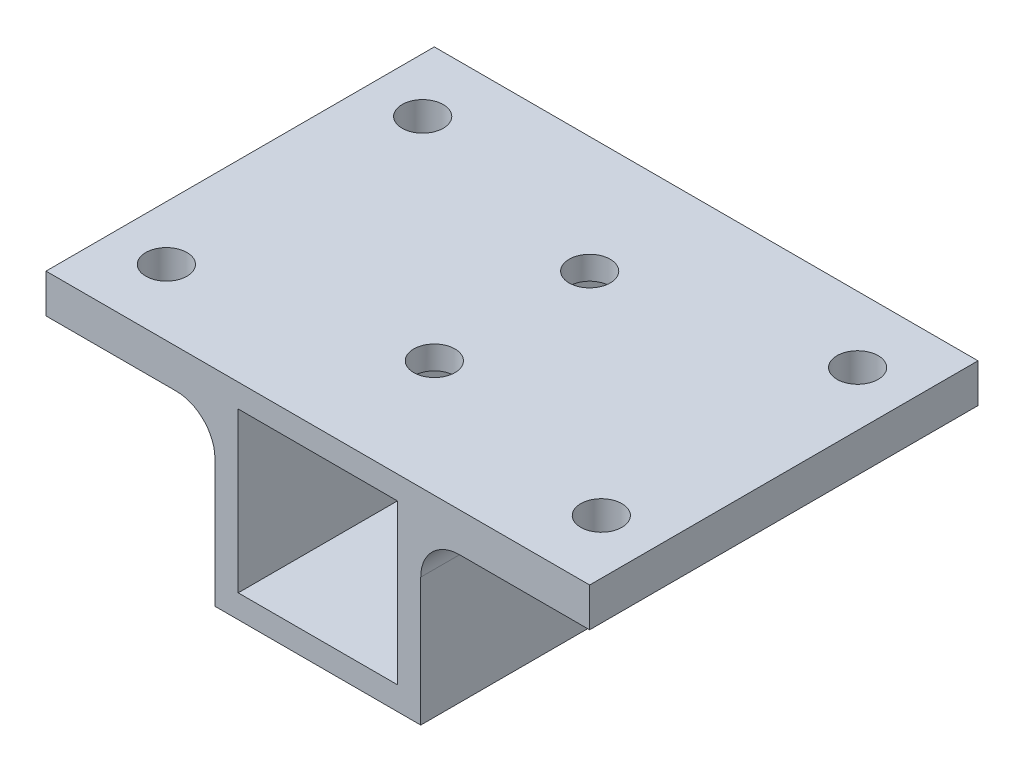
ISO-10303-21;
HEADER;
FILE_DESCRIPTION(('STEP AP214'),'2;1');
FILE_NAME('part.step','',(''),(''),'','','');
FILE_SCHEMA(('AUTOMOTIVE_DESIGN { 1 0 10303 214 1 1 1 1 }'));
ENDSEC;
DATA;
#1=APPLICATION_CONTEXT('core data for automotive mechanical design processes');
#2=APPLICATION_PROTOCOL_DEFINITION('international standard','automotive_design',2000,#1);
#3=PRODUCT_CONTEXT('',#1,'mechanical');
#4=PRODUCT('Part','Part','',(#3));
#5=PRODUCT_RELATED_PRODUCT_CATEGORY('part','',(#4));
#6=PRODUCT_DEFINITION_FORMATION('','',#4);
#7=PRODUCT_DEFINITION_CONTEXT('part definition',#1,'design');
#8=PRODUCT_DEFINITION('design','',#6,#7);
#9=PRODUCT_DEFINITION_SHAPE('','',#8);
#10=(LENGTH_UNIT() NAMED_UNIT(*) SI_UNIT(.MILLI.,.METRE.));
#11=(NAMED_UNIT(*) PLANE_ANGLE_UNIT() SI_UNIT($,.RADIAN.));
#12=(NAMED_UNIT(*) SI_UNIT($,.STERADIAN.) SOLID_ANGLE_UNIT());
#13=UNCERTAINTY_MEASURE_WITH_UNIT(LENGTH_MEASURE(1.E-05),#10,'distance_accuracy_value','');
#14=(GEOMETRIC_REPRESENTATION_CONTEXT(3) GLOBAL_UNCERTAINTY_ASSIGNED_CONTEXT((#13)) GLOBAL_UNIT_ASSIGNED_CONTEXT((#10,
#11,#12)) REPRESENTATION_CONTEXT('',''));
#15=CARTESIAN_POINT('',(0.,0.,0.));
#16=DIRECTION('',(0.,0.,1.));
#17=DIRECTION('',(1.,0.,0.));
#18=AXIS2_PLACEMENT_3D('',#15,#16,#17);
#19=CARTESIAN_POINT('',(-13.25,-13.25,50.));
#20=DIRECTION('',(1.,0.,0.));
#21=DIRECTION('',(0.,0.,-1.));
#22=AXIS2_PLACEMENT_3D('',#19,#20,#21);
#23=PLANE('',#22);
#24=CARTESIAN_POINT('',(-13.25,0.,15.));
#25=DIRECTION('',(-1.,0.,0.));
#26=DIRECTION('',(0.,0.,1.));
#27=AXIS2_PLACEMENT_3D('',#24,#25,#26);
#28=CIRCLE('',#27,2.65);
#29=CARTESIAN_POINT('',(-13.25,0.,17.65));
#30=VERTEX_POINT('',#29);
#31=EDGE_CURVE('E319',#30,#30,#28,.T.);
#32=ORIENTED_EDGE('',*,*,#31,.F.);
#33=EDGE_LOOP('',(#32));
#34=FACE_BOUND('',#33,.T.);
#35=CARTESIAN_POINT('',(-13.25,0.,35.));
#36=DIRECTION('',(-1.,0.,0.));
#37=DIRECTION('',(0.,0.,1.));
#38=AXIS2_PLACEMENT_3D('',#35,#36,#37);
#39=CIRCLE('',#38,2.65);
#40=CARTESIAN_POINT('',(-13.25,0.,37.65));
#41=VERTEX_POINT('',#40);
#42=EDGE_CURVE('E455',#41,#41,#39,.T.);
#43=ORIENTED_EDGE('',*,*,#42,.F.);
#44=EDGE_LOOP('',(#43));
#45=FACE_BOUND('',#44,.T.);
#46=DIRECTION('',(0.,-1.,0.));
#47=VECTOR('',#46,1.);
#48=CARTESIAN_POINT('',(-13.25,-13.25,50.));
#49=LINE('',#48,#47);
#50=CARTESIAN_POINT('',(-13.25,3.25,50.));
#51=VERTEX_POINT('',#50);
#52=CARTESIAN_POINT('',(-13.25,-13.25,50.));
#53=VERTEX_POINT('',#52);
#54=EDGE_CURVE('E272',#51,#53,#49,.T.);
#55=ORIENTED_EDGE('',*,*,#54,.F.);
#56=DIRECTION('',(0.,0.,1.));
#57=VECTOR('',#56,1.);
#58=CARTESIAN_POINT('',(-13.25,3.25,0.));
#59=LINE('',#58,#57);
#60=CARTESIAN_POINT('',(-13.25,3.25,0.));
#61=VERTEX_POINT('',#60);
#62=EDGE_CURVE('E328',#51,#61,#59,.F.);
#63=ORIENTED_EDGE('',*,*,#62,.T.);
#64=DIRECTION('',(0.,-1.,0.));
#65=VECTOR('',#64,1.);
#66=CARTESIAN_POINT('',(-13.25,-13.25,0.));
#67=LINE('',#66,#65);
#68=CARTESIAN_POINT('',(-13.25,-13.25,0.));
#69=VERTEX_POINT('',#68);
#70=EDGE_CURVE('E271',#61,#69,#67,.T.);
#71=ORIENTED_EDGE('',*,*,#70,.T.);
#72=DIRECTION('',(0.,0.,-1.));
#73=VECTOR('',#72,1.);
#74=CARTESIAN_POINT('',(-13.25,-13.25,50.));
#75=LINE('',#74,#73);
#76=EDGE_CURVE('E299',#53,#69,#75,.T.);
#77=ORIENTED_EDGE('',*,*,#76,.F.);
#78=EDGE_LOOP('',(#55,#63,#71,#77));
#79=FACE_BOUND('',#78,.T.);
#80=ADVANCED_FACE('F47',(#34,#45,#79),#23,.F.);
#81=CARTESIAN_POINT('',(13.25,-13.25,50.));
#82=DIRECTION('',(-1.,0.,0.));
#83=DIRECTION('',(0.,0.,1.));
#84=AXIS2_PLACEMENT_3D('',#81,#82,#83);
#85=PLANE('',#84);
#86=CARTESIAN_POINT('',(13.25,0.,15.));
#87=DIRECTION('',(-1.,0.,0.));
#88=DIRECTION('',(0.,0.,1.));
#89=AXIS2_PLACEMENT_3D('',#86,#87,#88);
#90=CIRCLE('',#89,2.65);
#91=CARTESIAN_POINT('',(13.25,0.,17.65));
#92=VERTEX_POINT('',#91);
#93=EDGE_CURVE('E470',#92,#92,#90,.T.);
#94=ORIENTED_EDGE('',*,*,#93,.T.);
#95=EDGE_LOOP('',(#94));
#96=FACE_BOUND('',#95,.T.);
#97=CARTESIAN_POINT('',(13.25,0.,35.));
#98=DIRECTION('',(-1.,0.,0.));
#99=DIRECTION('',(0.,0.,1.));
#100=AXIS2_PLACEMENT_3D('',#97,#98,#99);
#101=CIRCLE('',#100,2.65);
#102=CARTESIAN_POINT('',(13.25,0.,37.65));
#103=VERTEX_POINT('',#102);
#104=EDGE_CURVE('E325',#103,#103,#101,.T.);
#105=ORIENTED_EDGE('',*,*,#104,.T.);
#106=EDGE_LOOP('',(#105));
#107=FACE_BOUND('',#106,.T.);
#108=DIRECTION('',(0.,1.,0.));
#109=VECTOR('',#108,1.);
#110=CARTESIAN_POINT('',(13.25,-13.25,0.));
#111=LINE('',#110,#109);
#112=CARTESIAN_POINT('',(13.25,-13.25,0.));
#113=VERTEX_POINT('',#112);
#114=CARTESIAN_POINT('',(13.25,3.25,0.));
#115=VERTEX_POINT('',#114);
#116=EDGE_CURVE('E291',#113,#115,#111,.T.);
#117=ORIENTED_EDGE('',*,*,#116,.T.);
#118=DIRECTION('',(0.,0.,-1.));
#119=VECTOR('',#118,1.);
#120=CARTESIAN_POINT('',(13.25,3.25,50.));
#121=LINE('',#120,#119);
#122=CARTESIAN_POINT('',(13.25,3.25,50.));
#123=VERTEX_POINT('',#122);
#124=EDGE_CURVE('E69',#115,#123,#121,.F.);
#125=ORIENTED_EDGE('',*,*,#124,.T.);
#126=DIRECTION('',(0.,1.,0.));
#127=VECTOR('',#126,1.);
#128=CARTESIAN_POINT('',(13.25,-13.25,50.));
#129=LINE('',#128,#127);
#130=CARTESIAN_POINT('',(13.25,-13.25,50.));
#131=VERTEX_POINT('',#130);
#132=EDGE_CURVE('E279',#131,#123,#129,.T.);
#133=ORIENTED_EDGE('',*,*,#132,.F.);
#134=DIRECTION('',(0.,0.,-1.));
#135=VECTOR('',#134,1.);
#136=CARTESIAN_POINT('',(13.25,-13.25,50.));
#137=LINE('',#136,#135);
#138=EDGE_CURVE('E285',#131,#113,#137,.T.);
#139=ORIENTED_EDGE('',*,*,#138,.T.);
#140=EDGE_LOOP('',(#117,#125,#133,#139));
#141=FACE_BOUND('',#140,.T.);
#142=ADVANCED_FACE('F366',(#96,#107,#141),#85,.F.);
#143=CARTESIAN_POINT('',(0.,0.,50.));
#144=DIRECTION('',(0.,0.,-1.));
#145=DIRECTION('',(-1.,0.,0.));
#146=AXIS2_PLACEMENT_3D('',#143,#144,#145);
#147=PLANE('',#146);
#148=DIRECTION('',(-1.,0.,0.));
#149=VECTOR('',#148,1.);
#150=CARTESIAN_POINT('',(-13.25,13.25,50.));
#151=LINE('',#150,#149);
#152=CARTESIAN_POINT('',(35.,13.25,50.));
#153=VERTEX_POINT('',#152);
#154=CARTESIAN_POINT('',(-35.,13.25,50.));
#155=VERTEX_POINT('',#154);
#156=EDGE_CURVE('E282',#153,#155,#151,.T.);
#157=ORIENTED_EDGE('',*,*,#156,.T.);
#158=DIRECTION('',(0.,1.,0.));
#159=VECTOR('',#158,1.);
#160=CARTESIAN_POINT('',(-35.,8.25,50.));
#161=LINE('',#160,#159);
#162=CARTESIAN_POINT('',(-35.,8.25,50.));
#163=VERTEX_POINT('',#162);
#164=EDGE_CURVE('E179',#163,#155,#161,.T.);
#165=ORIENTED_EDGE('',*,*,#164,.F.);
#166=DIRECTION('',(1.,0.,0.));
#167=VECTOR('',#166,1.);
#168=CARTESIAN_POINT('',(0.,8.25,50.));
#169=LINE('',#168,#167);
#170=CARTESIAN_POINT('',(-18.25,8.25,50.));
#171=VERTEX_POINT('',#170);
#172=EDGE_CURVE('E163',#163,#171,#169,.T.);
#173=ORIENTED_EDGE('',*,*,#172,.T.);
#174=CARTESIAN_POINT('',(-18.25,3.25,50.));
#175=DIRECTION('',(0.,0.,-1.));
#176=DIRECTION('',(-1.,0.,0.));
#177=AXIS2_PLACEMENT_3D('',#174,#175,#176);
#178=CIRCLE('',#177,5.);
#179=EDGE_CURVE('E337',#171,#51,#178,.T.);
#180=ORIENTED_EDGE('',*,*,#179,.T.);
#181=ORIENTED_EDGE('',*,*,#54,.T.);
#182=DIRECTION('',(1.,0.,0.));
#183=VECTOR('',#182,1.);
#184=CARTESIAN_POINT('',(-13.25,-13.25,50.));
#185=LINE('',#184,#183);
#186=EDGE_CURVE('E275',#53,#131,#185,.T.);
#187=ORIENTED_EDGE('',*,*,#186,.T.);
#188=ORIENTED_EDGE('',*,*,#132,.T.);
#189=CARTESIAN_POINT('',(18.25,3.25,50.));
#190=DIRECTION('',(0.,0.,-1.));
#191=DIRECTION('',(-1.,0.,0.));
#192=AXIS2_PLACEMENT_3D('',#189,#190,#191);
#193=CIRCLE('',#192,5.);
#194=CARTESIAN_POINT('',(18.25,8.25,50.));
#195=VERTEX_POINT('',#194);
#196=EDGE_CURVE('E11',#123,#195,#193,.T.);
#197=ORIENTED_EDGE('',*,*,#196,.T.);
#198=DIRECTION('',(1.,0.,0.));
#199=VECTOR('',#198,1.);
#200=CARTESIAN_POINT('',(0.,8.25,50.));
#201=LINE('',#200,#199);
#202=CARTESIAN_POINT('',(35.,8.25,50.));
#203=VERTEX_POINT('',#202);
#204=EDGE_CURVE('E193',#195,#203,#201,.T.);
#205=ORIENTED_EDGE('',*,*,#204,.T.);
#206=DIRECTION('',(0.,1.,0.));
#207=VECTOR('',#206,1.);
#208=CARTESIAN_POINT('',(35.,8.25,50.));
#209=LINE('',#208,#207);
#210=EDGE_CURVE('E208',#203,#153,#209,.T.);
#211=ORIENTED_EDGE('',*,*,#210,.T.);
#212=EDGE_LOOP('',(#157,#165,#173,#180,#181,#187,#188,#197,#205,#211));
#213=FACE_BOUND('',#212,.T.);
#214=DIRECTION('',(0.,1.,0.));
#215=VECTOR('',#214,1.);
#216=CARTESIAN_POINT('',(10.25,-10.25,50.));
#217=LINE('',#216,#215);
#218=CARTESIAN_POINT('',(10.25,-10.25,50.));
#219=VERTEX_POINT('',#218);
#220=CARTESIAN_POINT('',(10.25,10.25,50.));
#221=VERTEX_POINT('',#220);
#222=EDGE_CURVE('E229',#219,#221,#217,.T.);
#223=ORIENTED_EDGE('',*,*,#222,.F.);
#224=DIRECTION('',(1.,0.,0.));
#225=VECTOR('',#224,1.);
#226=CARTESIAN_POINT('',(-10.25,-10.25,50.));
#227=LINE('',#226,#225);
#228=CARTESIAN_POINT('',(-10.25,-10.25,50.));
#229=VERTEX_POINT('',#228);
#230=EDGE_CURVE('E240',#229,#219,#227,.T.);
#231=ORIENTED_EDGE('',*,*,#230,.F.);
#232=DIRECTION('',(0.,-1.,0.));
#233=VECTOR('',#232,1.);
#234=CARTESIAN_POINT('',(-10.25,-10.25,50.));
#235=LINE('',#234,#233);
#236=CARTESIAN_POINT('',(-10.25,10.25,50.));
#237=VERTEX_POINT('',#236);
#238=EDGE_CURVE('E236',#237,#229,#235,.T.);
#239=ORIENTED_EDGE('',*,*,#238,.F.);
#240=DIRECTION('',(-1.,0.,0.));
#241=VECTOR('',#240,1.);
#242=CARTESIAN_POINT('',(-10.25,10.25,50.));
#243=LINE('',#242,#241);
#244=EDGE_CURVE('E232',#221,#237,#243,.T.);
#245=ORIENTED_EDGE('',*,*,#244,.F.);
#246=EDGE_LOOP('',(#223,#231,#239,#245));
#247=FACE_BOUND('',#246,.T.);
#248=ADVANCED_FACE('F344',(#213,#247),#147,.F.);
#249=CARTESIAN_POINT('',(0.,0.,0.));
#250=DIRECTION('',(0.,0.,-1.));
#251=DIRECTION('',(-1.,0.,0.));
#252=AXIS2_PLACEMENT_3D('',#249,#250,#251);
#253=PLANE('',#252);
#254=ORIENTED_EDGE('',*,*,#70,.F.);
#255=CARTESIAN_POINT('',(-18.25,3.25,0.));
#256=DIRECTION('',(0.,0.,-1.));
#257=DIRECTION('',(-1.,0.,0.));
#258=AXIS2_PLACEMENT_3D('',#255,#256,#257);
#259=CIRCLE('',#258,5.);
#260=CARTESIAN_POINT('',(-18.25,8.25,0.));
#261=VERTEX_POINT('',#260);
#262=EDGE_CURVE('E157',#61,#261,#259,.F.);
#263=ORIENTED_EDGE('',*,*,#262,.T.);
#264=DIRECTION('',(1.,0.,0.));
#265=VECTOR('',#264,1.);
#266=CARTESIAN_POINT('',(0.,8.25,0.));
#267=LINE('',#266,#265);
#268=CARTESIAN_POINT('',(-35.,8.25,0.));
#269=VERTEX_POINT('',#268);
#270=EDGE_CURVE('E148',#269,#261,#267,.T.);
#271=ORIENTED_EDGE('',*,*,#270,.F.);
#272=DIRECTION('',(0.,1.,0.));
#273=VECTOR('',#272,1.);
#274=CARTESIAN_POINT('',(-35.,8.25,0.));
#275=LINE('',#274,#273);
#276=CARTESIAN_POINT('',(-35.,13.25,0.));
#277=VERTEX_POINT('',#276);
#278=EDGE_CURVE('E154',#269,#277,#275,.T.);
#279=ORIENTED_EDGE('',*,*,#278,.T.);
#280=DIRECTION('',(-1.,0.,0.));
#281=VECTOR('',#280,1.);
#282=CARTESIAN_POINT('',(-13.25,13.25,0.));
#283=LINE('',#282,#281);
#284=CARTESIAN_POINT('',(35.,13.25,0.));
#285=VERTEX_POINT('',#284);
#286=EDGE_CURVE('E276',#285,#277,#283,.T.);
#287=ORIENTED_EDGE('',*,*,#286,.F.);
#288=DIRECTION('',(0.,1.,0.));
#289=VECTOR('',#288,1.);
#290=CARTESIAN_POINT('',(35.,8.25,0.));
#291=LINE('',#290,#289);
#292=CARTESIAN_POINT('',(35.,8.25,0.));
#293=VERTEX_POINT('',#292);
#294=EDGE_CURVE('E221',#293,#285,#291,.T.);
#295=ORIENTED_EDGE('',*,*,#294,.F.);
#296=DIRECTION('',(1.,0.,0.));
#297=VECTOR('',#296,1.);
#298=CARTESIAN_POINT('',(0.,8.25,0.));
#299=LINE('',#298,#297);
#300=CARTESIAN_POINT('',(18.25,8.25,0.));
#301=VERTEX_POINT('',#300);
#302=EDGE_CURVE('E201',#301,#293,#299,.T.);
#303=ORIENTED_EDGE('',*,*,#302,.F.);
#304=CARTESIAN_POINT('',(18.25,3.25,0.));
#305=DIRECTION('',(0.,0.,-1.));
#306=DIRECTION('',(-1.,0.,0.));
#307=AXIS2_PLACEMENT_3D('',#304,#305,#306);
#308=CIRCLE('',#307,5.);
#309=EDGE_CURVE('E56',#301,#115,#308,.F.);
#310=ORIENTED_EDGE('',*,*,#309,.T.);
#311=ORIENTED_EDGE('',*,*,#116,.F.);
#312=DIRECTION('',(1.,0.,0.));
#313=VECTOR('',#312,1.);
#314=CARTESIAN_POINT('',(-13.25,-13.25,0.));
#315=LINE('',#314,#313);
#316=EDGE_CURVE('E288',#69,#113,#315,.T.);
#317=ORIENTED_EDGE('',*,*,#316,.F.);
#318=EDGE_LOOP('',(#254,#263,#271,#279,#287,#295,#303,#310,#311,#317));
#319=FACE_BOUND('',#318,.T.);
#320=DIRECTION('',(1.,0.,0.));
#321=VECTOR('',#320,1.);
#322=CARTESIAN_POINT('',(-10.25,-10.25,0.));
#323=LINE('',#322,#321);
#324=CARTESIAN_POINT('',(-10.25,-10.25,0.));
#325=VERTEX_POINT('',#324);
#326=CARTESIAN_POINT('',(10.25,-10.25,0.));
#327=VERTEX_POINT('',#326);
#328=EDGE_CURVE('E233',#325,#327,#323,.T.);
#329=ORIENTED_EDGE('',*,*,#328,.T.);
#330=DIRECTION('',(0.,1.,0.));
#331=VECTOR('',#330,1.);
#332=CARTESIAN_POINT('',(10.25,-10.25,0.));
#333=LINE('',#332,#331);
#334=CARTESIAN_POINT('',(10.25,10.25,0.));
#335=VERTEX_POINT('',#334);
#336=EDGE_CURVE('E183',#327,#335,#333,.T.);
#337=ORIENTED_EDGE('',*,*,#336,.T.);
#338=DIRECTION('',(-1.,0.,0.));
#339=VECTOR('',#338,1.);
#340=CARTESIAN_POINT('',(-10.25,10.25,0.));
#341=LINE('',#340,#339);
#342=CARTESIAN_POINT('',(-10.25,10.25,0.));
#343=VERTEX_POINT('',#342);
#344=EDGE_CURVE('E247',#335,#343,#341,.T.);
#345=ORIENTED_EDGE('',*,*,#344,.T.);
#346=DIRECTION('',(0.,-1.,0.));
#347=VECTOR('',#346,1.);
#348=CARTESIAN_POINT('',(-10.25,-10.25,0.));
#349=LINE('',#348,#347);
#350=EDGE_CURVE('E251',#343,#325,#349,.T.);
#351=ORIENTED_EDGE('',*,*,#350,.T.);
#352=EDGE_LOOP('',(#329,#337,#345,#351));
#353=FACE_BOUND('',#352,.T.);
#354=ADVANCED_FACE('F151',(#319,#353),#253,.T.);
#355=CARTESIAN_POINT('',(-13.25,-13.25,50.));
#356=DIRECTION('',(0.,1.,0.));
#357=DIRECTION('',(0.,0.,1.));
#358=AXIS2_PLACEMENT_3D('',#355,#356,#357);
#359=PLANE('',#358);
#360=CARTESIAN_POINT('',(0.,-13.25,15.));
#361=DIRECTION('',(0.,1.,0.));
#362=DIRECTION('',(0.,0.,1.));
#363=AXIS2_PLACEMENT_3D('',#360,#361,#362);
#364=CIRCLE('',#363,2.65);
#365=CARTESIAN_POINT('',(0.,-13.25,17.65));
#366=VERTEX_POINT('',#365);
#367=EDGE_CURVE('E309',#366,#366,#364,.T.);
#368=ORIENTED_EDGE('',*,*,#367,.T.);
#369=EDGE_LOOP('',(#368));
#370=FACE_BOUND('',#369,.T.);
#371=CARTESIAN_POINT('',(0.,-13.25,35.));
#372=DIRECTION('',(0.,1.,0.));
#373=DIRECTION('',(0.,0.,1.));
#374=AXIS2_PLACEMENT_3D('',#371,#372,#373);
#375=CIRCLE('',#374,2.65);
#376=CARTESIAN_POINT('',(0.,-13.25,37.65));
#377=VERTEX_POINT('',#376);
#378=EDGE_CURVE('E482',#377,#377,#375,.T.);
#379=ORIENTED_EDGE('',*,*,#378,.T.);
#380=EDGE_LOOP('',(#379));
#381=FACE_BOUND('',#380,.T.);
#382=ORIENTED_EDGE('',*,*,#316,.T.);
#383=ORIENTED_EDGE('',*,*,#138,.F.);
#384=ORIENTED_EDGE('',*,*,#186,.F.);
#385=ORIENTED_EDGE('',*,*,#76,.T.);
#386=EDGE_LOOP('',(#382,#383,#384,#385));
#387=FACE_BOUND('',#386,.T.);
#388=ADVANCED_FACE('F376',(#370,#381,#387),#359,.F.);
#389=CARTESIAN_POINT('',(-13.25,13.25,50.));
#390=DIRECTION('',(0.,-1.,0.));
#391=DIRECTION('',(0.,0.,-1.));
#392=AXIS2_PLACEMENT_3D('',#389,#390,#391);
#393=PLANE('',#392);
#394=CARTESIAN_POINT('',(0.,13.25,15.));
#395=DIRECTION('',(0.,1.,0.));
#396=DIRECTION('',(0.,0.,1.));
#397=AXIS2_PLACEMENT_3D('',#394,#395,#396);
#398=CIRCLE('',#397,2.65);
#399=CARTESIAN_POINT('',(0.,13.25,17.65));
#400=VERTEX_POINT('',#399);
#401=EDGE_CURVE('E478',#400,#400,#398,.T.);
#402=ORIENTED_EDGE('',*,*,#401,.F.);
#403=EDGE_LOOP('',(#402));
#404=FACE_BOUND('',#403,.T.);
#405=CARTESIAN_POINT('',(0.,13.25,35.));
#406=DIRECTION('',(0.,1.,0.));
#407=DIRECTION('',(0.,0.,1.));
#408=AXIS2_PLACEMENT_3D('',#405,#406,#407);
#409=CIRCLE('',#408,2.65);
#410=CARTESIAN_POINT('',(0.,13.25,37.65));
#411=VERTEX_POINT('',#410);
#412=EDGE_CURVE('E474',#411,#411,#409,.T.);
#413=ORIENTED_EDGE('',*,*,#412,.F.);
#414=EDGE_LOOP('',(#413));
#415=FACE_BOUND('',#414,.T.);
#416=ORIENTED_EDGE('',*,*,#286,.T.);
#417=DIRECTION('',(0.,0.,-1.));
#418=VECTOR('',#417,1.);
#419=CARTESIAN_POINT('',(-35.,13.25,0.));
#420=LINE('',#419,#418);
#421=EDGE_CURVE('E177',#155,#277,#420,.T.);
#422=ORIENTED_EDGE('',*,*,#421,.F.);
#423=ORIENTED_EDGE('',*,*,#156,.F.);
#424=DIRECTION('',(0.,0.,-1.));
#425=VECTOR('',#424,1.);
#426=CARTESIAN_POINT('',(35.,13.25,0.));
#427=LINE('',#426,#425);
#428=EDGE_CURVE('E213',#153,#285,#427,.T.);
#429=ORIENTED_EDGE('',*,*,#428,.T.);
#430=EDGE_LOOP('',(#416,#422,#423,#429));
#431=FACE_BOUND('',#430,.T.);
#432=CARTESIAN_POINT('',(28.0000000000001,13.25,41.5000000000002));
#433=DIRECTION('',(0.,1.,0.));
#434=DIRECTION('',(0.,0.,1.));
#435=AXIS2_PLACEMENT_3D('',#432,#433,#434);
#436=CIRCLE('',#435,2.65000000000001);
#437=CARTESIAN_POINT('',(28.0000000000001,13.25,44.1500000000002));
#438=VERTEX_POINT('',#437);
#439=EDGE_CURVE('E209',#438,#438,#436,.T.);
#440=ORIENTED_EDGE('',*,*,#439,.F.);
#441=EDGE_LOOP('',(#440));
#442=FACE_BOUND('',#441,.T.);
#443=CARTESIAN_POINT('',(28.0000000000001,13.25,8.49999999999978));
#444=DIRECTION('',(0.,1.,0.));
#445=DIRECTION('',(0.,0.,1.));
#446=AXIS2_PLACEMENT_3D('',#443,#444,#445);
#447=CIRCLE('',#446,2.65000000000001);
#448=CARTESIAN_POINT('',(28.0000000000001,13.25,11.1499999999998));
#449=VERTEX_POINT('',#448);
#450=EDGE_CURVE('E194',#449,#449,#447,.F.);
#451=ORIENTED_EDGE('',*,*,#450,.T.);
#452=EDGE_LOOP('',(#451));
#453=FACE_BOUND('',#452,.T.);
#454=CARTESIAN_POINT('',(-28.,13.25,8.5));
#455=DIRECTION('',(0.,1.,0.));
#456=DIRECTION('',(0.,0.,1.));
#457=AXIS2_PLACEMENT_3D('',#454,#455,#456);
#458=CIRCLE('',#457,2.65);
#459=CARTESIAN_POINT('',(-28.,13.25,11.15));
#460=VERTEX_POINT('',#459);
#461=EDGE_CURVE('E225',#460,#460,#458,.T.);
#462=ORIENTED_EDGE('',*,*,#461,.F.);
#463=EDGE_LOOP('',(#462));
#464=FACE_BOUND('',#463,.T.);
#465=CARTESIAN_POINT('',(-28.,13.25,41.5));
#466=DIRECTION('',(0.,1.,0.));
#467=DIRECTION('',(0.,0.,1.));
#468=AXIS2_PLACEMENT_3D('',#465,#466,#467);
#469=CIRCLE('',#468,2.65);
#470=CARTESIAN_POINT('',(-28.,13.25,44.15));
#471=VERTEX_POINT('',#470);
#472=EDGE_CURVE('E499',#471,#471,#469,.F.);
#473=ORIENTED_EDGE('',*,*,#472,.T.);
#474=EDGE_LOOP('',(#473));
#475=FACE_BOUND('',#474,.T.);
#476=ADVANCED_FACE('F378',(#404,#415,#431,#442,#453,#464,#475),#393,.F.);
#477=CARTESIAN_POINT('',(10.25,-10.25,50.));
#478=DIRECTION('',(-1.,0.,0.));
#479=DIRECTION('',(0.,0.,1.));
#480=AXIS2_PLACEMENT_3D('',#477,#478,#479);
#481=PLANE('',#480);
#482=CARTESIAN_POINT('',(10.25,0.,15.));
#483=DIRECTION('',(-1.,0.,0.));
#484=DIRECTION('',(0.,0.,1.));
#485=AXIS2_PLACEMENT_3D('',#482,#483,#484);
#486=CIRCLE('',#485,2.65);
#487=CARTESIAN_POINT('',(10.25,0.,17.65));
#488=VERTEX_POINT('',#487);
#489=EDGE_CURVE('E324',#488,#488,#486,.T.);
#490=ORIENTED_EDGE('',*,*,#489,.F.);
#491=EDGE_LOOP('',(#490));
#492=FACE_BOUND('',#491,.T.);
#493=CARTESIAN_POINT('',(10.25,0.,35.));
#494=DIRECTION('',(-1.,0.,0.));
#495=DIRECTION('',(0.,0.,1.));
#496=AXIS2_PLACEMENT_3D('',#493,#494,#495);
#497=CIRCLE('',#496,2.65);
#498=CARTESIAN_POINT('',(10.25,0.,37.65));
#499=VERTEX_POINT('',#498);
#500=EDGE_CURVE('E318',#499,#499,#497,.T.);
#501=ORIENTED_EDGE('',*,*,#500,.F.);
#502=EDGE_LOOP('',(#501));
#503=FACE_BOUND('',#502,.T.);
#504=ORIENTED_EDGE('',*,*,#336,.F.);
#505=DIRECTION('',(0.,0.,-1.));
#506=VECTOR('',#505,1.);
#507=CARTESIAN_POINT('',(10.25,-10.25,50.));
#508=LINE('',#507,#506);
#509=EDGE_CURVE('E243',#219,#327,#508,.T.);
#510=ORIENTED_EDGE('',*,*,#509,.F.);
#511=ORIENTED_EDGE('',*,*,#222,.T.);
#512=DIRECTION('',(0.,0.,-1.));
#513=VECTOR('',#512,1.);
#514=CARTESIAN_POINT('',(10.25,10.25,50.));
#515=LINE('',#514,#513);
#516=EDGE_CURVE('E267',#221,#335,#515,.T.);
#517=ORIENTED_EDGE('',*,*,#516,.T.);
#518=EDGE_LOOP('',(#504,#510,#511,#517));
#519=FACE_BOUND('',#518,.T.);
#520=ADVANCED_FACE('F383',(#492,#503,#519),#481,.T.);
#521=CARTESIAN_POINT('',(-10.25,10.25,50.));
#522=DIRECTION('',(0.,-1.,0.));
#523=DIRECTION('',(0.,0.,-1.));
#524=AXIS2_PLACEMENT_3D('',#521,#522,#523);
#525=PLANE('',#524);
#526=CARTESIAN_POINT('',(0.,10.25,15.));
#527=DIRECTION('',(0.,-1.,0.));
#528=DIRECTION('',(0.,0.,-1.));
#529=AXIS2_PLACEMENT_3D('',#526,#527,#528);
#530=CIRCLE('',#529,2.65);
#531=CARTESIAN_POINT('',(0.,10.25,12.35));
#532=VERTEX_POINT('',#531);
#533=EDGE_CURVE('E214',#532,#532,#530,.T.);
#534=ORIENTED_EDGE('',*,*,#533,.F.);
#535=EDGE_LOOP('',(#534));
#536=FACE_BOUND('',#535,.T.);
#537=CARTESIAN_POINT('',(0.,10.25,35.));
#538=DIRECTION('',(0.,-1.,0.));
#539=DIRECTION('',(0.,0.,-1.));
#540=AXIS2_PLACEMENT_3D('',#537,#538,#539);
#541=CIRCLE('',#540,2.65);
#542=CARTESIAN_POINT('',(0.,10.25,32.35));
#543=VERTEX_POINT('',#542);
#544=EDGE_CURVE('E308',#543,#543,#541,.T.);
#545=ORIENTED_EDGE('',*,*,#544,.F.);
#546=EDGE_LOOP('',(#545));
#547=FACE_BOUND('',#546,.T.);
#548=ORIENTED_EDGE('',*,*,#344,.F.);
#549=ORIENTED_EDGE('',*,*,#516,.F.);
#550=ORIENTED_EDGE('',*,*,#244,.T.);
#551=DIRECTION('',(0.,0.,-1.));
#552=VECTOR('',#551,1.);
#553=CARTESIAN_POINT('',(-10.25,10.25,50.));
#554=LINE('',#553,#552);
#555=EDGE_CURVE('E264',#237,#343,#554,.T.);
#556=ORIENTED_EDGE('',*,*,#555,.T.);
#557=EDGE_LOOP('',(#548,#549,#550,#556));
#558=FACE_BOUND('',#557,.T.);
#559=ADVANCED_FACE('F391',(#536,#547,#558),#525,.T.);
#560=CARTESIAN_POINT('',(-10.25,-10.25,50.));
#561=DIRECTION('',(1.,0.,0.));
#562=DIRECTION('',(0.,0.,-1.));
#563=AXIS2_PLACEMENT_3D('',#560,#561,#562);
#564=PLANE('',#563);
#565=CARTESIAN_POINT('',(-10.25,0.,15.));
#566=DIRECTION('',(1.,0.,0.));
#567=DIRECTION('',(0.,0.,-1.));
#568=AXIS2_PLACEMENT_3D('',#565,#566,#567);
#569=CIRCLE('',#568,2.65);
#570=CARTESIAN_POINT('',(-10.25,0.,12.35));
#571=VERTEX_POINT('',#570);
#572=EDGE_CURVE('E320',#571,#571,#569,.T.);
#573=ORIENTED_EDGE('',*,*,#572,.F.);
#574=EDGE_LOOP('',(#573));
#575=FACE_BOUND('',#574,.T.);
#576=CARTESIAN_POINT('',(-10.25,0.,35.));
#577=DIRECTION('',(1.,0.,0.));
#578=DIRECTION('',(0.,0.,-1.));
#579=AXIS2_PLACEMENT_3D('',#576,#577,#578);
#580=CIRCLE('',#579,2.65);
#581=CARTESIAN_POINT('',(-10.25,0.,32.35));
#582=VERTEX_POINT('',#581);
#583=EDGE_CURVE('E314',#582,#582,#580,.T.);
#584=ORIENTED_EDGE('',*,*,#583,.F.);
#585=EDGE_LOOP('',(#584));
#586=FACE_BOUND('',#585,.T.);
#587=ORIENTED_EDGE('',*,*,#350,.F.);
#588=ORIENTED_EDGE('',*,*,#555,.F.);
#589=ORIENTED_EDGE('',*,*,#238,.T.);
#590=DIRECTION('',(0.,0.,-1.));
#591=VECTOR('',#590,1.);
#592=CARTESIAN_POINT('',(-10.25,-10.25,50.));
#593=LINE('',#592,#591);
#594=EDGE_CURVE('E261',#229,#325,#593,.T.);
#595=ORIENTED_EDGE('',*,*,#594,.T.);
#596=EDGE_LOOP('',(#587,#588,#589,#595));
#597=FACE_BOUND('',#596,.T.);
#598=ADVANCED_FACE('F395',(#575,#586,#597),#564,.T.);
#599=CARTESIAN_POINT('',(-10.25,-10.25,50.));
#600=DIRECTION('',(0.,1.,0.));
#601=DIRECTION('',(0.,0.,1.));
#602=AXIS2_PLACEMENT_3D('',#599,#600,#601);
#603=PLANE('',#602);
#604=CARTESIAN_POINT('',(0.,-10.25,15.));
#605=DIRECTION('',(0.,1.,0.));
#606=DIRECTION('',(0.,0.,1.));
#607=AXIS2_PLACEMENT_3D('',#604,#605,#606);
#608=CIRCLE('',#607,2.65);
#609=CARTESIAN_POINT('',(0.,-10.25,17.65));
#610=VERTEX_POINT('',#609);
#611=EDGE_CURVE('E310',#610,#610,#608,.T.);
#612=ORIENTED_EDGE('',*,*,#611,.F.);
#613=EDGE_LOOP('',(#612));
#614=FACE_BOUND('',#613,.T.);
#615=CARTESIAN_POINT('',(0.,-10.25,35.));
#616=DIRECTION('',(0.,1.,0.));
#617=DIRECTION('',(0.,0.,1.));
#618=AXIS2_PLACEMENT_3D('',#615,#616,#617);
#619=CIRCLE('',#618,2.65);
#620=CARTESIAN_POINT('',(0.,-10.25,37.65));
#621=VERTEX_POINT('',#620);
#622=EDGE_CURVE('E304',#621,#621,#619,.T.);
#623=ORIENTED_EDGE('',*,*,#622,.F.);
#624=EDGE_LOOP('',(#623));
#625=FACE_BOUND('',#624,.T.);
#626=ORIENTED_EDGE('',*,*,#328,.F.);
#627=ORIENTED_EDGE('',*,*,#594,.F.);
#628=ORIENTED_EDGE('',*,*,#230,.T.);
#629=ORIENTED_EDGE('',*,*,#509,.T.);
#630=EDGE_LOOP('',(#626,#627,#628,#629));
#631=FACE_BOUND('',#630,.T.);
#632=ADVANCED_FACE('F399',(#614,#625,#631),#603,.T.);
#633=CARTESIAN_POINT('',(35.,8.25,0.));
#634=DIRECTION('',(1.,0.,0.));
#635=DIRECTION('',(0.,0.,-1.));
#636=AXIS2_PLACEMENT_3D('',#633,#634,#635);
#637=PLANE('',#636);
#638=ORIENTED_EDGE('',*,*,#428,.F.);
#639=ORIENTED_EDGE('',*,*,#210,.F.);
#640=DIRECTION('',(0.,0.,-1.));
#641=VECTOR('',#640,1.);
#642=CARTESIAN_POINT('',(35.,8.25,0.));
#643=LINE('',#642,#641);
#644=EDGE_CURVE('E197',#203,#293,#643,.T.);
#645=ORIENTED_EDGE('',*,*,#644,.T.);
#646=ORIENTED_EDGE('',*,*,#294,.T.);
#647=EDGE_LOOP('',(#638,#639,#645,#646));
#648=FACE_BOUND('',#647,.T.);
#649=ADVANCED_FACE('F403',(#648),#637,.T.);
#650=CARTESIAN_POINT('',(28.0000000000001,8.25,41.5000000000002));
#651=DIRECTION('',(0.,1.,0.));
#652=DIRECTION('',(0.,0.,1.));
#653=AXIS2_PLACEMENT_3D('',#650,#651,#652);
#654=CYLINDRICAL_SURFACE('',#653,2.65000000000001);
#655=CARTESIAN_POINT('',(28.0000000000001,8.25,41.5000000000002));
#656=DIRECTION('',(0.,1.,0.));
#657=DIRECTION('',(0.,0.,1.));
#658=AXIS2_PLACEMENT_3D('',#655,#656,#657);
#659=CIRCLE('',#658,2.65000000000001);
#660=CARTESIAN_POINT('',(28.0000000000001,8.25,44.1500000000002));
#661=VERTEX_POINT('',#660);
#662=EDGE_CURVE('E189',#661,#661,#659,.T.);
#663=ORIENTED_EDGE('',*,*,#662,.F.);
#664=EDGE_LOOP('',(#663));
#665=FACE_BOUND('',#664,.T.);
#666=ORIENTED_EDGE('',*,*,#439,.T.);
#667=EDGE_LOOP('',(#666));
#668=FACE_BOUND('',#667,.T.);
#669=ADVANCED_FACE('F405',(#665,#668),#654,.F.);
#670=CARTESIAN_POINT('',(28.0000000000001,8.25,8.49999999999978));
#671=DIRECTION('',(0.,1.,0.));
#672=DIRECTION('',(0.,0.,1.));
#673=AXIS2_PLACEMENT_3D('',#670,#671,#672);
#674=CYLINDRICAL_SURFACE('',#673,2.65000000000001);
#675=CARTESIAN_POINT('',(28.0000000000001,8.25,8.49999999999978));
#676=DIRECTION('',(0.,1.,0.));
#677=DIRECTION('',(0.,0.,1.));
#678=AXIS2_PLACEMENT_3D('',#675,#676,#677);
#679=CIRCLE('',#678,2.65000000000001);
#680=CARTESIAN_POINT('',(28.0000000000001,8.25,11.1499999999998));
#681=VERTEX_POINT('',#680);
#682=EDGE_CURVE('E204',#681,#681,#679,.F.);
#683=ORIENTED_EDGE('',*,*,#682,.T.);
#684=EDGE_LOOP('',(#683));
#685=FACE_BOUND('',#684,.T.);
#686=ORIENTED_EDGE('',*,*,#450,.F.);
#687=EDGE_LOOP('',(#686));
#688=FACE_BOUND('',#687,.T.);
#689=ADVANCED_FACE('F408',(#685,#688),#674,.F.);
#690=CARTESIAN_POINT('',(0.,8.25,0.));
#691=DIRECTION('',(0.,1.,0.));
#692=DIRECTION('',(0.,0.,1.));
#693=AXIS2_PLACEMENT_3D('',#690,#691,#692);
#694=PLANE('',#693);
#695=ORIENTED_EDGE('',*,*,#662,.T.);
#696=EDGE_LOOP('',(#695));
#697=FACE_BOUND('',#696,.T.);
#698=ORIENTED_EDGE('',*,*,#204,.F.);
#699=DIRECTION('',(0.,0.,-1.));
#700=VECTOR('',#699,1.);
#701=CARTESIAN_POINT('',(18.25,8.25,0.));
#702=LINE('',#701,#700);
#703=EDGE_CURVE('E331',#195,#301,#702,.T.);
#704=ORIENTED_EDGE('',*,*,#703,.T.);
#705=ORIENTED_EDGE('',*,*,#302,.T.);
#706=ORIENTED_EDGE('',*,*,#644,.F.);
#707=EDGE_LOOP('',(#698,#704,#705,#706));
#708=FACE_BOUND('',#707,.T.);
#709=ORIENTED_EDGE('',*,*,#682,.F.);
#710=EDGE_LOOP('',(#709));
#711=FACE_BOUND('',#710,.T.);
#712=ADVANCED_FACE('F415',(#697,#708,#711),#694,.F.);
#713=CARTESIAN_POINT('',(-35.,8.25,0.));
#714=DIRECTION('',(1.,0.,0.));
#715=DIRECTION('',(0.,0.,-1.));
#716=AXIS2_PLACEMENT_3D('',#713,#714,#715);
#717=PLANE('',#716);
#718=ORIENTED_EDGE('',*,*,#421,.T.);
#719=ORIENTED_EDGE('',*,*,#278,.F.);
#720=DIRECTION('',(0.,0.,-1.));
#721=VECTOR('',#720,1.);
#722=CARTESIAN_POINT('',(-35.,8.25,0.));
#723=LINE('',#722,#721);
#724=EDGE_CURVE('E162',#163,#269,#723,.T.);
#725=ORIENTED_EDGE('',*,*,#724,.F.);
#726=ORIENTED_EDGE('',*,*,#164,.T.);
#727=EDGE_LOOP('',(#718,#719,#725,#726));
#728=FACE_BOUND('',#727,.T.);
#729=ADVANCED_FACE('F175',(#728),#717,.F.);
#730=CARTESIAN_POINT('',(-28.,8.25,8.5));
#731=DIRECTION('',(0.,1.,0.));
#732=DIRECTION('',(0.,0.,1.));
#733=AXIS2_PLACEMENT_3D('',#730,#731,#732);
#734=CYLINDRICAL_SURFACE('',#733,2.65);
#735=CARTESIAN_POINT('',(-28.,8.25,8.5));
#736=DIRECTION('',(0.,1.,0.));
#737=DIRECTION('',(0.,0.,1.));
#738=AXIS2_PLACEMENT_3D('',#735,#736,#737);
#739=CIRCLE('',#738,2.65);
#740=CARTESIAN_POINT('',(-28.,8.25,11.15));
#741=VERTEX_POINT('',#740);
#742=EDGE_CURVE('E495',#741,#741,#739,.T.);
#743=ORIENTED_EDGE('',*,*,#742,.F.);
#744=EDGE_LOOP('',(#743));
#745=FACE_BOUND('',#744,.T.);
#746=ORIENTED_EDGE('',*,*,#461,.T.);
#747=EDGE_LOOP('',(#746));
#748=FACE_BOUND('',#747,.T.);
#749=ADVANCED_FACE('F420',(#745,#748),#734,.F.);
#750=CARTESIAN_POINT('',(-28.,8.25,41.5));
#751=DIRECTION('',(0.,1.,0.));
#752=DIRECTION('',(0.,0.,1.));
#753=AXIS2_PLACEMENT_3D('',#750,#751,#752);
#754=CYLINDRICAL_SURFACE('',#753,2.65);
#755=CARTESIAN_POINT('',(-28.,8.25,41.5));
#756=DIRECTION('',(0.,1.,0.));
#757=DIRECTION('',(0.,0.,1.));
#758=AXIS2_PLACEMENT_3D('',#755,#756,#757);
#759=CIRCLE('',#758,2.65);
#760=CARTESIAN_POINT('',(-28.,8.25,44.15));
#761=VERTEX_POINT('',#760);
#762=EDGE_CURVE('E173',#761,#761,#759,.F.);
#763=ORIENTED_EDGE('',*,*,#762,.T.);
#764=EDGE_LOOP('',(#763));
#765=FACE_BOUND('',#764,.T.);
#766=ORIENTED_EDGE('',*,*,#472,.F.);
#767=EDGE_LOOP('',(#766));
#768=FACE_BOUND('',#767,.T.);
#769=ADVANCED_FACE('F423',(#765,#768),#754,.F.);
#770=CARTESIAN_POINT('',(0.,8.25,0.));
#771=DIRECTION('',(0.,1.,0.));
#772=DIRECTION('',(0.,0.,1.));
#773=AXIS2_PLACEMENT_3D('',#770,#771,#772);
#774=PLANE('',#773);
#775=ORIENTED_EDGE('',*,*,#742,.T.);
#776=EDGE_LOOP('',(#775));
#777=FACE_BOUND('',#776,.T.);
#778=ORIENTED_EDGE('',*,*,#270,.T.);
#779=DIRECTION('',(0.,0.,1.));
#780=VECTOR('',#779,1.);
#781=CARTESIAN_POINT('',(-18.25,8.25,50.));
#782=LINE('',#781,#780);
#783=EDGE_CURVE('E303',#261,#171,#782,.T.);
#784=ORIENTED_EDGE('',*,*,#783,.T.);
#785=ORIENTED_EDGE('',*,*,#172,.F.);
#786=ORIENTED_EDGE('',*,*,#724,.T.);
#787=EDGE_LOOP('',(#778,#784,#785,#786));
#788=FACE_BOUND('',#787,.T.);
#789=ORIENTED_EDGE('',*,*,#762,.F.);
#790=EDGE_LOOP('',(#789));
#791=FACE_BOUND('',#790,.T.);
#792=ADVANCED_FACE('F167',(#777,#788,#791),#774,.F.);
#793=CARTESIAN_POINT('',(0.,-13.25,35.));
#794=DIRECTION('',(0.,1.,0.));
#795=DIRECTION('',(0.,0.,1.));
#796=AXIS2_PLACEMENT_3D('',#793,#794,#795);
#797=CYLINDRICAL_SURFACE('',#796,2.65);
#798=ORIENTED_EDGE('',*,*,#622,.T.);
#799=EDGE_LOOP('',(#798));
#800=FACE_BOUND('',#799,.T.);
#801=ORIENTED_EDGE('',*,*,#378,.F.);
#802=EDGE_LOOP('',(#801));
#803=FACE_BOUND('',#802,.T.);
#804=ADVANCED_FACE('F431',(#800,#803),#797,.F.);
#805=CARTESIAN_POINT('',(0.,-13.25,15.));
#806=DIRECTION('',(0.,1.,0.));
#807=DIRECTION('',(0.,0.,1.));
#808=AXIS2_PLACEMENT_3D('',#805,#806,#807);
#809=CYLINDRICAL_SURFACE('',#808,2.65);
#810=ORIENTED_EDGE('',*,*,#611,.T.);
#811=EDGE_LOOP('',(#810));
#812=FACE_BOUND('',#811,.T.);
#813=ORIENTED_EDGE('',*,*,#367,.F.);
#814=EDGE_LOOP('',(#813));
#815=FACE_BOUND('',#814,.T.);
#816=ADVANCED_FACE('F435',(#812,#815),#809,.F.);
#817=ORIENTED_EDGE('',*,*,#544,.T.);
#818=EDGE_LOOP('',(#817));
#819=FACE_BOUND('',#818,.T.);
#820=ORIENTED_EDGE('',*,*,#412,.T.);
#821=EDGE_LOOP('',(#820));
#822=FACE_BOUND('',#821,.T.);
#823=ADVANCED_FACE('F437',(#819,#822),#797,.F.);
#824=ORIENTED_EDGE('',*,*,#533,.T.);
#825=EDGE_LOOP('',(#824));
#826=FACE_BOUND('',#825,.T.);
#827=ORIENTED_EDGE('',*,*,#401,.T.);
#828=EDGE_LOOP('',(#827));
#829=FACE_BOUND('',#828,.T.);
#830=ADVANCED_FACE('F441',(#826,#829),#809,.F.);
#831=CARTESIAN_POINT('',(35.,0.,35.));
#832=DIRECTION('',(-1.,0.,0.));
#833=DIRECTION('',(0.,0.,1.));
#834=AXIS2_PLACEMENT_3D('',#831,#832,#833);
#835=CYLINDRICAL_SURFACE('',#834,2.65);
#836=ORIENTED_EDGE('',*,*,#583,.T.);
#837=EDGE_LOOP('',(#836));
#838=FACE_BOUND('',#837,.T.);
#839=ORIENTED_EDGE('',*,*,#42,.T.);
#840=EDGE_LOOP('',(#839));
#841=FACE_BOUND('',#840,.T.);
#842=ADVANCED_FACE('F442',(#838,#841),#835,.F.);
#843=CARTESIAN_POINT('',(35.,0.,15.));
#844=DIRECTION('',(-1.,0.,0.));
#845=DIRECTION('',(0.,0.,1.));
#846=AXIS2_PLACEMENT_3D('',#843,#844,#845);
#847=CYLINDRICAL_SURFACE('',#846,2.65);
#848=ORIENTED_EDGE('',*,*,#572,.T.);
#849=EDGE_LOOP('',(#848));
#850=FACE_BOUND('',#849,.T.);
#851=ORIENTED_EDGE('',*,*,#31,.T.);
#852=EDGE_LOOP('',(#851));
#853=FACE_BOUND('',#852,.T.);
#854=ADVANCED_FACE('F363',(#850,#853),#847,.F.);
#855=ORIENTED_EDGE('',*,*,#500,.T.);
#856=EDGE_LOOP('',(#855));
#857=FACE_BOUND('',#856,.T.);
#858=ORIENTED_EDGE('',*,*,#104,.F.);
#859=EDGE_LOOP('',(#858));
#860=FACE_BOUND('',#859,.T.);
#861=ADVANCED_FACE('F360',(#857,#860),#835,.F.);
#862=ORIENTED_EDGE('',*,*,#489,.T.);
#863=EDGE_LOOP('',(#862));
#864=FACE_BOUND('',#863,.T.);
#865=ORIENTED_EDGE('',*,*,#93,.F.);
#866=EDGE_LOOP('',(#865));
#867=FACE_BOUND('',#866,.T.);
#868=ADVANCED_FACE('F353',(#864,#867),#847,.F.);
#869=CARTESIAN_POINT('',(-18.25,3.25,0.));
#870=DIRECTION('',(0.,0.,-1.));
#871=DIRECTION('',(-1.,0.,0.));
#872=AXIS2_PLACEMENT_3D('',#869,#870,#871);
#873=CYLINDRICAL_SURFACE('',#872,5.);
#874=ORIENTED_EDGE('',*,*,#262,.F.);
#875=ORIENTED_EDGE('',*,*,#62,.F.);
#876=ORIENTED_EDGE('',*,*,#179,.F.);
#877=ORIENTED_EDGE('',*,*,#783,.F.);
#878=EDGE_LOOP('',(#874,#875,#876,#877));
#879=FACE_BOUND('',#878,.T.);
#880=ADVANCED_FACE('F351',(#879),#873,.F.);
#881=CARTESIAN_POINT('',(18.25,3.25,0.));
#882=DIRECTION('',(0.,0.,1.));
#883=DIRECTION('',(1.,0.,0.));
#884=AXIS2_PLACEMENT_3D('',#881,#882,#883);
#885=CYLINDRICAL_SURFACE('',#884,5.);
#886=ORIENTED_EDGE('',*,*,#196,.F.);
#887=ORIENTED_EDGE('',*,*,#124,.F.);
#888=ORIENTED_EDGE('',*,*,#309,.F.);
#889=ORIENTED_EDGE('',*,*,#703,.F.);
#890=EDGE_LOOP('',(#886,#887,#888,#889));
#891=FACE_BOUND('',#890,.T.);
#892=ADVANCED_FACE('F49',(#891),#885,.F.);
#893=CLOSED_SHELL('',(#80,#142,#248,#354,#388,#476,#520,#559,#598,#632,#649,#669,#689,#712,#729,
#749,#769,#792,#804,#816,#823,#830,#842,#854,#861,#868,#880,#892));
#894=MANIFOLD_SOLID_BREP('B2',#893);
#895=ADVANCED_BREP_SHAPE_REPRESENTATION('',(#18,#894),#14);
#896=SHAPE_DEFINITION_REPRESENTATION(#9,#895);
ENDSEC;
END-ISO-10303-21;
